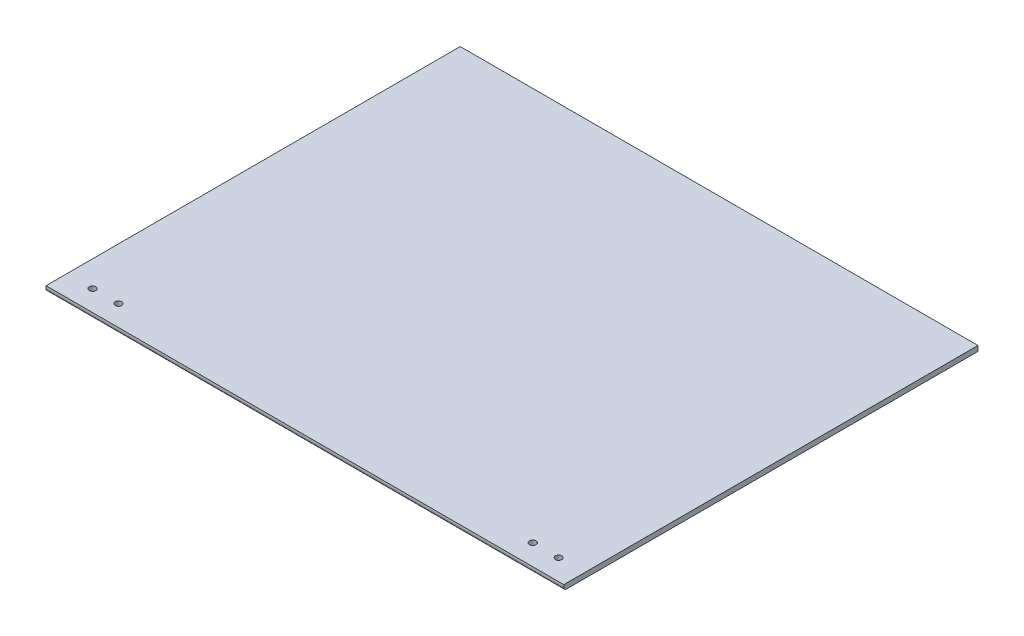
ISO-10303-21;
HEADER;
FILE_DESCRIPTION(('STEP AP214'),'2;1');
FILE_NAME('part.step','',(''),(''),'','','');
FILE_SCHEMA(('AUTOMOTIVE_DESIGN { 1 0 10303 214 1 1 1 1 }'));
ENDSEC;
DATA;
#1=APPLICATION_CONTEXT('core data for automotive mechanical design processes');
#2=APPLICATION_PROTOCOL_DEFINITION('international standard','automotive_design',2000,#1);
#3=PRODUCT_CONTEXT('',#1,'mechanical');
#4=PRODUCT('Part','Part','',(#3));
#5=PRODUCT_RELATED_PRODUCT_CATEGORY('part','',(#4));
#6=PRODUCT_DEFINITION_FORMATION('','',#4);
#7=PRODUCT_DEFINITION_CONTEXT('part definition',#1,'design');
#8=PRODUCT_DEFINITION('design','',#6,#7);
#9=PRODUCT_DEFINITION_SHAPE('','',#8);
#10=(LENGTH_UNIT() NAMED_UNIT(*) SI_UNIT(.MILLI.,.METRE.));
#11=(NAMED_UNIT(*) PLANE_ANGLE_UNIT() SI_UNIT($,.RADIAN.));
#12=(NAMED_UNIT(*) SI_UNIT($,.STERADIAN.) SOLID_ANGLE_UNIT());
#13=UNCERTAINTY_MEASURE_WITH_UNIT(LENGTH_MEASURE(1.E-05),#10,'distance_accuracy_value','');
#14=(GEOMETRIC_REPRESENTATION_CONTEXT(3) GLOBAL_UNCERTAINTY_ASSIGNED_CONTEXT((#13)) GLOBAL_UNIT_ASSIGNED_CONTEXT((#10,
#11,#12)) REPRESENTATION_CONTEXT('',''));
#15=CARTESIAN_POINT('',(0.,0.,0.));
#16=DIRECTION('',(0.,0.,1.));
#17=DIRECTION('',(1.,0.,0.));
#18=AXIS2_PLACEMENT_3D('',#15,#16,#17);
#19=CARTESIAN_POINT('',(0.,2.5,-2.5));
#20=DIRECTION('',(-1.,0.,0.));
#21=DIRECTION('',(0.,0.,1.));
#22=AXIS2_PLACEMENT_3D('',#19,#20,#21);
#23=CYLINDRICAL_SURFACE('',#22,2.5);
#24=DIRECTION('',(1.,0.,0.));
#25=VECTOR('',#24,1.);
#26=CARTESIAN_POINT('',(0.,2.5,0.));
#27=LINE('',#26,#25);
#28=CARTESIAN_POINT('',(0.,2.5,0.));
#29=VERTEX_POINT('',#28);
#30=CARTESIAN_POINT('',(500.,2.5,0.));
#31=VERTEX_POINT('',#30);
#32=EDGE_CURVE('E100',#29,#31,#27,.T.);
#33=ORIENTED_EDGE('',*,*,#32,.F.);
#34=CARTESIAN_POINT('',(0.,2.5,-2.5));
#35=DIRECTION('',(1.,0.,0.));
#36=DIRECTION('',(0.,0.,-1.));
#37=AXIS2_PLACEMENT_3D('',#34,#35,#36);
#38=CIRCLE('',#37,2.5);
#39=CARTESIAN_POINT('',(0.,0.,-2.5));
#40=VERTEX_POINT('',#39);
#41=EDGE_CURVE('E40',#40,#29,#38,.F.);
#42=ORIENTED_EDGE('',*,*,#41,.F.);
#43=DIRECTION('',(1.,0.,0.));
#44=VECTOR('',#43,1.);
#45=CARTESIAN_POINT('',(0.,0.,-2.5));
#46=LINE('',#45,#44);
#47=CARTESIAN_POINT('',(500.,0.,-2.5));
#48=VERTEX_POINT('',#47);
#49=EDGE_CURVE('E102',#48,#40,#46,.F.);
#50=ORIENTED_EDGE('',*,*,#49,.F.);
#51=CARTESIAN_POINT('',(500.,2.5,-2.5));
#52=DIRECTION('',(-1.,0.,0.));
#53=DIRECTION('',(0.,0.,1.));
#54=AXIS2_PLACEMENT_3D('',#51,#52,#53);
#55=CIRCLE('',#54,2.5);
#56=EDGE_CURVE('E11',#31,#48,#55,.F.);
#57=ORIENTED_EDGE('',*,*,#56,.F.);
#58=EDGE_LOOP('',(#33,#42,#50,#57));
#59=FACE_BOUND('',#58,.T.);
#60=ADVANCED_FACE('F33',(#59),#23,.T.);
#61=CARTESIAN_POINT('',(0.,5.,-400.));
#62=DIRECTION('',(0.,-1.,0.));
#63=DIRECTION('',(0.,0.,-1.));
#64=AXIS2_PLACEMENT_3D('',#61,#62,#63);
#65=PLANE('',#64);
#66=CARTESIAN_POINT('',(450.,5.,-20.));
#67=DIRECTION('',(0.,1.,0.));
#68=DIRECTION('',(0.,0.,1.));
#69=AXIS2_PLACEMENT_3D('',#66,#67,#68);
#70=CIRCLE('',#69,3.17499999999997);
#71=CARTESIAN_POINT('',(450.,5.,-16.8250000000001));
#72=VERTEX_POINT('',#71);
#73=EDGE_CURVE('E123',#72,#72,#70,.T.);
#74=ORIENTED_EDGE('',*,*,#73,.F.);
#75=EDGE_LOOP('',(#74));
#76=FACE_BOUND('',#75,.T.);
#77=CARTESIAN_POINT('',(475.,5.,-20.));
#78=DIRECTION('',(0.,1.,0.));
#79=DIRECTION('',(0.,0.,1.));
#80=AXIS2_PLACEMENT_3D('',#77,#78,#79);
#81=CIRCLE('',#80,3.17499999999997);
#82=CARTESIAN_POINT('',(475.,5.,-16.8250000000001));
#83=VERTEX_POINT('',#82);
#84=EDGE_CURVE('E120',#83,#83,#81,.T.);
#85=ORIENTED_EDGE('',*,*,#84,.F.);
#86=EDGE_LOOP('',(#85));
#87=FACE_BOUND('',#86,.T.);
#88=CARTESIAN_POINT('',(25.,5.,-20.));
#89=DIRECTION('',(0.,1.,0.));
#90=DIRECTION('',(0.,0.,1.));
#91=AXIS2_PLACEMENT_3D('',#88,#89,#90);
#92=CIRCLE('',#91,3.17499999999997);
#93=CARTESIAN_POINT('',(25.,5.,-16.825));
#94=VERTEX_POINT('',#93);
#95=EDGE_CURVE('E112',#94,#94,#92,.F.);
#96=ORIENTED_EDGE('',*,*,#95,.T.);
#97=EDGE_LOOP('',(#96));
#98=FACE_BOUND('',#97,.T.);
#99=DIRECTION('',(0.,0.,1.));
#100=VECTOR('',#99,1.);
#101=CARTESIAN_POINT('',(0.,5.,0.));
#102=LINE('',#101,#100);
#103=CARTESIAN_POINT('',(0.,5.,-400.));
#104=VERTEX_POINT('',#103);
#105=CARTESIAN_POINT('',(0.,5.,0.));
#106=VERTEX_POINT('',#105);
#107=EDGE_CURVE('E86',#104,#106,#102,.T.);
#108=ORIENTED_EDGE('',*,*,#107,.T.);
#109=DIRECTION('',(1.,0.,0.));
#110=VECTOR('',#109,1.);
#111=CARTESIAN_POINT('',(0.,5.,0.));
#112=LINE('',#111,#110);
#113=CARTESIAN_POINT('',(500.,5.,0.));
#114=VERTEX_POINT('',#113);
#115=EDGE_CURVE('E76',#106,#114,#112,.T.);
#116=ORIENTED_EDGE('',*,*,#115,.T.);
#117=DIRECTION('',(0.,0.,-1.));
#118=VECTOR('',#117,1.);
#119=CARTESIAN_POINT('',(500.,5.,0.));
#120=LINE('',#119,#118);
#121=CARTESIAN_POINT('',(500.,5.,-400.));
#122=VERTEX_POINT('',#121);
#123=EDGE_CURVE('E85',#114,#122,#120,.T.);
#124=ORIENTED_EDGE('',*,*,#123,.T.);
#125=DIRECTION('',(-1.,0.,0.));
#126=VECTOR('',#125,1.);
#127=CARTESIAN_POINT('',(0.,5.,-400.));
#128=LINE('',#127,#126);
#129=EDGE_CURVE('E92',#122,#104,#128,.T.);
#130=ORIENTED_EDGE('',*,*,#129,.T.);
#131=EDGE_LOOP('',(#108,#116,#124,#130));
#132=FACE_BOUND('',#131,.T.);
#133=CARTESIAN_POINT('',(50.,5.,-20.));
#134=DIRECTION('',(0.,1.,0.));
#135=DIRECTION('',(0.,0.,1.));
#136=AXIS2_PLACEMENT_3D('',#133,#134,#135);
#137=CIRCLE('',#136,3.17499999999997);
#138=CARTESIAN_POINT('',(50.,5.,-16.825));
#139=VERTEX_POINT('',#138);
#140=EDGE_CURVE('E116',#139,#139,#137,.F.);
#141=ORIENTED_EDGE('',*,*,#140,.T.);
#142=EDGE_LOOP('',(#141));
#143=FACE_BOUND('',#142,.T.);
#144=ADVANCED_FACE('F89',(#76,#87,#98,#132,#143),#65,.F.);
#145=CARTESIAN_POINT('',(0.,0.,-400.));
#146=DIRECTION('',(0.,-1.,0.));
#147=DIRECTION('',(0.,0.,-1.));
#148=AXIS2_PLACEMENT_3D('',#145,#146,#147);
#149=PLANE('',#148);
#150=CARTESIAN_POINT('',(450.,0.,-20.));
#151=DIRECTION('',(0.,-1.,0.));
#152=DIRECTION('',(0.,0.,-1.));
#153=AXIS2_PLACEMENT_3D('',#150,#151,#152);
#154=CIRCLE('',#153,3.17499999999997);
#155=CARTESIAN_POINT('',(450.,0.,-16.8250000000001));
#156=VERTEX_POINT('',#155);
#157=EDGE_CURVE('E121',#156,#156,#154,.T.);
#158=ORIENTED_EDGE('',*,*,#157,.F.);
#159=EDGE_LOOP('',(#158));
#160=FACE_BOUND('',#159,.T.);
#161=CARTESIAN_POINT('',(475.,0.,-20.));
#162=DIRECTION('',(0.,-1.,0.));
#163=DIRECTION('',(0.,0.,-1.));
#164=AXIS2_PLACEMENT_3D('',#161,#162,#163);
#165=CIRCLE('',#164,3.17499999999997);
#166=CARTESIAN_POINT('',(475.,0.,-16.8250000000001));
#167=VERTEX_POINT('',#166);
#168=EDGE_CURVE('E117',#167,#167,#165,.T.);
#169=ORIENTED_EDGE('',*,*,#168,.F.);
#170=EDGE_LOOP('',(#169));
#171=FACE_BOUND('',#170,.T.);
#172=CARTESIAN_POINT('',(25.,0.,-20.));
#173=DIRECTION('',(0.,-1.,0.));
#174=DIRECTION('',(0.,0.,-1.));
#175=AXIS2_PLACEMENT_3D('',#172,#173,#174);
#176=CIRCLE('',#175,3.17499999999997);
#177=CARTESIAN_POINT('',(25.,0.,-16.825));
#178=VERTEX_POINT('',#177);
#179=EDGE_CURVE('E108',#178,#178,#176,.F.);
#180=ORIENTED_EDGE('',*,*,#179,.T.);
#181=EDGE_LOOP('',(#180));
#182=FACE_BOUND('',#181,.T.);
#183=DIRECTION('',(0.,0.,-1.));
#184=VECTOR('',#183,1.);
#185=CARTESIAN_POINT('',(500.,0.,0.));
#186=LINE('',#185,#184);
#187=CARTESIAN_POINT('',(500.,0.,-400.));
#188=VERTEX_POINT('',#187);
#189=EDGE_CURVE('E131',#48,#188,#186,.T.);
#190=ORIENTED_EDGE('',*,*,#189,.F.);
#191=ORIENTED_EDGE('',*,*,#49,.T.);
#192=DIRECTION('',(0.,0.,1.));
#193=VECTOR('',#192,1.);
#194=CARTESIAN_POINT('',(0.,0.,0.));
#195=LINE('',#194,#193);
#196=CARTESIAN_POINT('',(0.,0.,-400.));
#197=VERTEX_POINT('',#196);
#198=EDGE_CURVE('E111',#197,#40,#195,.T.);
#199=ORIENTED_EDGE('',*,*,#198,.F.);
#200=DIRECTION('',(-1.,0.,0.));
#201=VECTOR('',#200,1.);
#202=CARTESIAN_POINT('',(0.,0.,-400.));
#203=LINE('',#202,#201);
#204=EDGE_CURVE('E96',#188,#197,#203,.T.);
#205=ORIENTED_EDGE('',*,*,#204,.F.);
#206=EDGE_LOOP('',(#190,#191,#199,#205));
#207=FACE_BOUND('',#206,.T.);
#208=CARTESIAN_POINT('',(50.,0.,-20.));
#209=DIRECTION('',(0.,-1.,0.));
#210=DIRECTION('',(0.,0.,-1.));
#211=AXIS2_PLACEMENT_3D('',#208,#209,#210);
#212=CIRCLE('',#211,3.17499999999997);
#213=CARTESIAN_POINT('',(50.,0.,-16.825));
#214=VERTEX_POINT('',#213);
#215=EDGE_CURVE('E113',#214,#214,#212,.F.);
#216=ORIENTED_EDGE('',*,*,#215,.T.);
#217=EDGE_LOOP('',(#216));
#218=FACE_BOUND('',#217,.T.);
#219=ADVANCED_FACE('F128',(#160,#171,#182,#207,#218),#149,.T.);
#220=CARTESIAN_POINT('',(0.,5.,0.));
#221=DIRECTION('',(1.,0.,0.));
#222=DIRECTION('',(0.,0.,-1.));
#223=AXIS2_PLACEMENT_3D('',#220,#221,#222);
#224=PLANE('',#223);
#225=ORIENTED_EDGE('',*,*,#198,.T.);
#226=ORIENTED_EDGE('',*,*,#41,.T.);
#227=DIRECTION('',(0.,-1.,0.));
#228=VECTOR('',#227,1.);
#229=CARTESIAN_POINT('',(0.,5.,0.));
#230=LINE('',#229,#228);
#231=EDGE_CURVE('E81',#106,#29,#230,.T.);
#232=ORIENTED_EDGE('',*,*,#231,.F.);
#233=ORIENTED_EDGE('',*,*,#107,.F.);
#234=DIRECTION('',(0.,-1.,0.));
#235=VECTOR('',#234,1.);
#236=CARTESIAN_POINT('',(0.,5.,-400.));
#237=LINE('',#236,#235);
#238=EDGE_CURVE('E132',#104,#197,#237,.T.);
#239=ORIENTED_EDGE('',*,*,#238,.T.);
#240=EDGE_LOOP('',(#225,#226,#232,#233,#239));
#241=FACE_BOUND('',#240,.T.);
#242=ADVANCED_FACE('F99',(#241),#224,.F.);
#243=CARTESIAN_POINT('',(0.,5.,0.));
#244=DIRECTION('',(0.,0.,-1.));
#245=DIRECTION('',(-1.,0.,0.));
#246=AXIS2_PLACEMENT_3D('',#243,#244,#245);
#247=PLANE('',#246);
#248=ORIENTED_EDGE('',*,*,#231,.T.);
#249=ORIENTED_EDGE('',*,*,#32,.T.);
#250=DIRECTION('',(0.,-1.,0.));
#251=VECTOR('',#250,1.);
#252=CARTESIAN_POINT('',(500.,5.,0.));
#253=LINE('',#252,#251);
#254=EDGE_CURVE('E82',#114,#31,#253,.T.);
#255=ORIENTED_EDGE('',*,*,#254,.F.);
#256=ORIENTED_EDGE('',*,*,#115,.F.);
#257=EDGE_LOOP('',(#248,#249,#255,#256));
#258=FACE_BOUND('',#257,.T.);
#259=ADVANCED_FACE('F78',(#258),#247,.F.);
#260=CARTESIAN_POINT('',(500.,5.,0.));
#261=DIRECTION('',(-1.,0.,0.));
#262=DIRECTION('',(0.,0.,1.));
#263=AXIS2_PLACEMENT_3D('',#260,#261,#262);
#264=PLANE('',#263);
#265=ORIENTED_EDGE('',*,*,#254,.T.);
#266=ORIENTED_EDGE('',*,*,#56,.T.);
#267=ORIENTED_EDGE('',*,*,#189,.T.);
#268=DIRECTION('',(0.,-1.,0.));
#269=VECTOR('',#268,1.);
#270=CARTESIAN_POINT('',(500.,5.,-400.));
#271=LINE('',#270,#269);
#272=EDGE_CURVE('E104',#122,#188,#271,.T.);
#273=ORIENTED_EDGE('',*,*,#272,.F.);
#274=ORIENTED_EDGE('',*,*,#123,.F.);
#275=EDGE_LOOP('',(#265,#266,#267,#273,#274));
#276=FACE_BOUND('',#275,.T.);
#277=ADVANCED_FACE('F143',(#276),#264,.F.);
#278=CARTESIAN_POINT('',(0.,5.,-400.));
#279=DIRECTION('',(0.,0.,1.));
#280=DIRECTION('',(1.,0.,0.));
#281=AXIS2_PLACEMENT_3D('',#278,#279,#280);
#282=PLANE('',#281);
#283=ORIENTED_EDGE('',*,*,#204,.T.);
#284=ORIENTED_EDGE('',*,*,#238,.F.);
#285=ORIENTED_EDGE('',*,*,#129,.F.);
#286=ORIENTED_EDGE('',*,*,#272,.T.);
#287=EDGE_LOOP('',(#283,#284,#285,#286));
#288=FACE_BOUND('',#287,.T.);
#289=ADVANCED_FACE('F142',(#288),#282,.F.);
#290=CARTESIAN_POINT('',(25.,-4.99999999999999,-20.));
#291=DIRECTION('',(0.,1.,0.));
#292=DIRECTION('',(0.,0.,1.));
#293=AXIS2_PLACEMENT_3D('',#290,#291,#292);
#294=CYLINDRICAL_SURFACE('',#293,3.17499999999997);
#295=CARTESIAN_POINT('',(25.,0.,-16.825));
#296=CARTESIAN_POINT('',(25.,0.0520833333333334,-16.825));
#297=CARTESIAN_POINT('',(25.,0.104166666666667,-16.825));
#298=CARTESIAN_POINT('',(25.,0.208333333333334,-16.825));
#299=CARTESIAN_POINT('',(25.,0.260416666666667,-16.825));
#300=CARTESIAN_POINT('',(25.,0.364583333333333,-16.825));
#301=CARTESIAN_POINT('',(25.,0.416666666666666,-16.825));
#302=CARTESIAN_POINT('',(25.,0.520833333333333,-16.825));
#303=CARTESIAN_POINT('',(25.,0.572916666666666,-16.825));
#304=CARTESIAN_POINT('',(25.,0.677083333333333,-16.825));
#305=CARTESIAN_POINT('',(25.,0.729166666666667,-16.825));
#306=CARTESIAN_POINT('',(25.,0.833333333333333,-16.825));
#307=CARTESIAN_POINT('',(25.,0.885416666666667,-16.825));
#308=CARTESIAN_POINT('',(25.,0.989583333333333,-16.825));
#309=CARTESIAN_POINT('',(25.,1.04166666666667,-16.825));
#310=CARTESIAN_POINT('',(25.,1.14583333333333,-16.825));
#311=CARTESIAN_POINT('',(25.,1.19791666666667,-16.825));
#312=CARTESIAN_POINT('',(25.,1.30208333333333,-16.825));
#313=CARTESIAN_POINT('',(25.,1.35416666666667,-16.825));
#314=CARTESIAN_POINT('',(25.,1.45833333333333,-16.825));
#315=CARTESIAN_POINT('',(25.,1.51041666666667,-16.825));
#316=CARTESIAN_POINT('',(25.,1.61458333333333,-16.825));
#317=CARTESIAN_POINT('',(25.,1.66666666666667,-16.825));
#318=CARTESIAN_POINT('',(25.,1.77083333333333,-16.825));
#319=CARTESIAN_POINT('',(25.,1.82291666666667,-16.825));
#320=CARTESIAN_POINT('',(25.,1.92708333333333,-16.825));
#321=CARTESIAN_POINT('',(25.,1.97916666666667,-16.825));
#322=CARTESIAN_POINT('',(25.,2.08333333333333,-16.825));
#323=CARTESIAN_POINT('',(25.,2.13541666666667,-16.825));
#324=CARTESIAN_POINT('',(25.,2.23958333333333,-16.825));
#325=CARTESIAN_POINT('',(25.,2.29166666666667,-16.825));
#326=CARTESIAN_POINT('',(25.,2.39583333333333,-16.825));
#327=CARTESIAN_POINT('',(25.,2.44791666666667,-16.825));
#328=CARTESIAN_POINT('',(25.,2.55208333333333,-16.825));
#329=CARTESIAN_POINT('',(25.,2.60416666666667,-16.825));
#330=CARTESIAN_POINT('',(25.,2.70833333333333,-16.825));
#331=CARTESIAN_POINT('',(25.,2.76041666666667,-16.825));
#332=CARTESIAN_POINT('',(25.,2.86458333333333,-16.825));
#333=CARTESIAN_POINT('',(25.,2.91666666666667,-16.825));
#334=CARTESIAN_POINT('',(25.,3.02083333333333,-16.825));
#335=CARTESIAN_POINT('',(25.,3.07291666666667,-16.825));
#336=CARTESIAN_POINT('',(25.,3.17708333333333,-16.825));
#337=CARTESIAN_POINT('',(25.,3.22916666666667,-16.825));
#338=CARTESIAN_POINT('',(25.,3.33333333333333,-16.825));
#339=CARTESIAN_POINT('',(25.,3.38541666666667,-16.825));
#340=CARTESIAN_POINT('',(25.,3.48958333333333,-16.825));
#341=CARTESIAN_POINT('',(25.,3.54166666666667,-16.825));
#342=CARTESIAN_POINT('',(25.,3.64583333333333,-16.825));
#343=CARTESIAN_POINT('',(25.,3.69791666666667,-16.825));
#344=CARTESIAN_POINT('',(25.,3.80208333333333,-16.825));
#345=CARTESIAN_POINT('',(25.,3.85416666666667,-16.825));
#346=CARTESIAN_POINT('',(25.,3.95833333333333,-16.825));
#347=CARTESIAN_POINT('',(25.,4.01041666666666,-16.825));
#348=CARTESIAN_POINT('',(25.,4.11458333333333,-16.825));
#349=CARTESIAN_POINT('',(25.,4.16666666666666,-16.825));
#350=CARTESIAN_POINT('',(25.,4.27083333333333,-16.825));
#351=CARTESIAN_POINT('',(25.,4.32291666666666,-16.825));
#352=CARTESIAN_POINT('',(25.,4.42708333333333,-16.825));
#353=CARTESIAN_POINT('',(25.,4.47916666666666,-16.825));
#354=CARTESIAN_POINT('',(25.,4.58333333333333,-16.825));
#355=CARTESIAN_POINT('',(25.,4.63541666666666,-16.825));
#356=CARTESIAN_POINT('',(25.,4.73958333333333,-16.825));
#357=CARTESIAN_POINT('',(25.,4.79166666666666,-16.825));
#358=CARTESIAN_POINT('',(25.,4.89583333333333,-16.825));
#359=CARTESIAN_POINT('',(25.,4.94791666666666,-16.825));
#360=CARTESIAN_POINT('',(25.,5.,-16.825));
#361=B_SPLINE_CURVE_WITH_KNOTS('',3,(#295,#296,#297,#298,#299,#300,#301,#302,#303,#304,#305,
#306,#307,#308,#309,#310,#311,#312,#313,#314,#315,#316,#317,#318,#319,#320,#321,#322,#323,#324,
#325,#326,#327,#328,#329,#330,#331,#332,#333,#334,#335,#336,#337,#338,#339,#340,#341,#342,#343,
#344,#345,#346,#347,#348,#349,#350,#351,#352,#353,#354,#355,#356,#357,#358,#359,#360),
.UNSPECIFIED.,.F.,.F.,(4,2,2,2,2,2,2,2,2,2,2,2,2,2,2,2,2,2,2,2,2,2,2,2,2,2,2,2,2,2,2,2,4),(0.,
0.15625,0.3125,0.46875,0.625,0.78125,0.9375,1.09375,1.25,1.40625,1.5625,1.71875,1.875,2.03125,
2.1875,2.34375,2.5,2.65625,2.8125,2.96875,3.125,3.28125,3.4375,3.59375,3.75,3.90625,4.0625,
4.21875,4.375,4.53125,4.6875,4.84375,5.),.UNSPECIFIED.);
#362=EDGE_CURVE('BSEAM163',#178,#94,#361,.T.);
#363=ORIENTED_EDGE('',*,*,#179,.F.);
#364=ORIENTED_EDGE('',*,*,#95,.F.);
#365=ORIENTED_EDGE('',*,*,#362,.T.);
#366=ORIENTED_EDGE('',*,*,#362,.F.);
#367=EDGE_LOOP('',(#363,#365,#364,#366));
#368=FACE_BOUND('',#367,.T.);
#369=ADVANCED_FACE('F163',(#368),#294,.F.);
#370=CARTESIAN_POINT('',(50.,-4.99999999999999,-20.));
#371=DIRECTION('',(0.,1.,0.));
#372=DIRECTION('',(0.,0.,1.));
#373=AXIS2_PLACEMENT_3D('',#370,#371,#372);
#374=CYLINDRICAL_SURFACE('',#373,3.17499999999997);
#375=CARTESIAN_POINT('',(50.,0.,-16.825));
#376=CARTESIAN_POINT('',(50.,0.0520833333333334,-16.825));
#377=CARTESIAN_POINT('',(50.,0.104166666666667,-16.825));
#378=CARTESIAN_POINT('',(50.,0.208333333333334,-16.825));
#379=CARTESIAN_POINT('',(50.,0.260416666666667,-16.825));
#380=CARTESIAN_POINT('',(50.,0.364583333333333,-16.825));
#381=CARTESIAN_POINT('',(50.,0.416666666666666,-16.825));
#382=CARTESIAN_POINT('',(50.,0.520833333333333,-16.825));
#383=CARTESIAN_POINT('',(50.,0.572916666666666,-16.825));
#384=CARTESIAN_POINT('',(50.,0.677083333333333,-16.825));
#385=CARTESIAN_POINT('',(50.,0.729166666666667,-16.825));
#386=CARTESIAN_POINT('',(50.,0.833333333333333,-16.825));
#387=CARTESIAN_POINT('',(50.,0.885416666666667,-16.825));
#388=CARTESIAN_POINT('',(50.,0.989583333333333,-16.825));
#389=CARTESIAN_POINT('',(50.,1.04166666666667,-16.825));
#390=CARTESIAN_POINT('',(50.,1.14583333333333,-16.825));
#391=CARTESIAN_POINT('',(50.,1.19791666666667,-16.825));
#392=CARTESIAN_POINT('',(50.,1.30208333333333,-16.825));
#393=CARTESIAN_POINT('',(50.,1.35416666666667,-16.825));
#394=CARTESIAN_POINT('',(50.,1.45833333333333,-16.825));
#395=CARTESIAN_POINT('',(50.,1.51041666666667,-16.825));
#396=CARTESIAN_POINT('',(50.,1.61458333333333,-16.825));
#397=CARTESIAN_POINT('',(50.,1.66666666666667,-16.825));
#398=CARTESIAN_POINT('',(50.,1.77083333333333,-16.825));
#399=CARTESIAN_POINT('',(50.,1.82291666666667,-16.825));
#400=CARTESIAN_POINT('',(50.,1.92708333333333,-16.825));
#401=CARTESIAN_POINT('',(50.,1.97916666666667,-16.825));
#402=CARTESIAN_POINT('',(50.,2.08333333333333,-16.825));
#403=CARTESIAN_POINT('',(50.,2.13541666666667,-16.825));
#404=CARTESIAN_POINT('',(50.,2.23958333333333,-16.825));
#405=CARTESIAN_POINT('',(50.,2.29166666666667,-16.825));
#406=CARTESIAN_POINT('',(50.,2.39583333333333,-16.825));
#407=CARTESIAN_POINT('',(50.,2.44791666666667,-16.825));
#408=CARTESIAN_POINT('',(50.,2.55208333333333,-16.825));
#409=CARTESIAN_POINT('',(50.,2.60416666666667,-16.825));
#410=CARTESIAN_POINT('',(50.,2.70833333333333,-16.825));
#411=CARTESIAN_POINT('',(50.,2.76041666666667,-16.825));
#412=CARTESIAN_POINT('',(50.,2.86458333333333,-16.825));
#413=CARTESIAN_POINT('',(50.,2.91666666666667,-16.825));
#414=CARTESIAN_POINT('',(50.,3.02083333333333,-16.825));
#415=CARTESIAN_POINT('',(50.,3.07291666666667,-16.825));
#416=CARTESIAN_POINT('',(50.,3.17708333333333,-16.825));
#417=CARTESIAN_POINT('',(50.,3.22916666666667,-16.825));
#418=CARTESIAN_POINT('',(50.,3.33333333333333,-16.825));
#419=CARTESIAN_POINT('',(50.,3.38541666666667,-16.825));
#420=CARTESIAN_POINT('',(50.,3.48958333333333,-16.825));
#421=CARTESIAN_POINT('',(50.,3.54166666666667,-16.825));
#422=CARTESIAN_POINT('',(50.,3.64583333333333,-16.825));
#423=CARTESIAN_POINT('',(50.,3.69791666666667,-16.825));
#424=CARTESIAN_POINT('',(50.,3.80208333333333,-16.825));
#425=CARTESIAN_POINT('',(50.,3.85416666666667,-16.825));
#426=CARTESIAN_POINT('',(50.,3.95833333333333,-16.825));
#427=CARTESIAN_POINT('',(50.,4.01041666666666,-16.825));
#428=CARTESIAN_POINT('',(50.,4.11458333333333,-16.825));
#429=CARTESIAN_POINT('',(50.,4.16666666666666,-16.825));
#430=CARTESIAN_POINT('',(50.,4.27083333333333,-16.825));
#431=CARTESIAN_POINT('',(50.,4.32291666666666,-16.825));
#432=CARTESIAN_POINT('',(50.,4.42708333333333,-16.825));
#433=CARTESIAN_POINT('',(50.,4.47916666666666,-16.825));
#434=CARTESIAN_POINT('',(50.,4.58333333333333,-16.825));
#435=CARTESIAN_POINT('',(50.,4.63541666666666,-16.825));
#436=CARTESIAN_POINT('',(50.,4.73958333333333,-16.825));
#437=CARTESIAN_POINT('',(50.,4.79166666666666,-16.825));
#438=CARTESIAN_POINT('',(50.,4.89583333333333,-16.825));
#439=CARTESIAN_POINT('',(50.,4.94791666666666,-16.825));
#440=CARTESIAN_POINT('',(50.,5.,-16.825));
#441=B_SPLINE_CURVE_WITH_KNOTS('',3,(#375,#376,#377,#378,#379,#380,#381,#382,#383,#384,#385,
#386,#387,#388,#389,#390,#391,#392,#393,#394,#395,#396,#397,#398,#399,#400,#401,#402,#403,#404,
#405,#406,#407,#408,#409,#410,#411,#412,#413,#414,#415,#416,#417,#418,#419,#420,#421,#422,#423,
#424,#425,#426,#427,#428,#429,#430,#431,#432,#433,#434,#435,#436,#437,#438,#439,#440),
.UNSPECIFIED.,.F.,.F.,(4,2,2,2,2,2,2,2,2,2,2,2,2,2,2,2,2,2,2,2,2,2,2,2,2,2,2,2,2,2,2,2,4),(0.,
0.15625,0.3125,0.46875,0.625,0.78125,0.9375,1.09375,1.25,1.40625,1.5625,1.71875,1.875,2.03125,
2.1875,2.34375,2.5,2.65625,2.8125,2.96875,3.125,3.28125,3.4375,3.59375,3.75,3.90625,4.0625,
4.21875,4.375,4.53125,4.6875,4.84375,5.),.UNSPECIFIED.);
#442=EDGE_CURVE('BSEAM165',#214,#139,#441,.T.);
#443=ORIENTED_EDGE('',*,*,#215,.F.);
#444=ORIENTED_EDGE('',*,*,#140,.F.);
#445=ORIENTED_EDGE('',*,*,#442,.T.);
#446=ORIENTED_EDGE('',*,*,#442,.F.);
#447=EDGE_LOOP('',(#443,#445,#444,#446));
#448=FACE_BOUND('',#447,.T.);
#449=ADVANCED_FACE('F165',(#448),#374,.F.);
#450=CARTESIAN_POINT('',(475.,-4.99999999999999,-20.));
#451=DIRECTION('',(0.,1.,0.));
#452=DIRECTION('',(0.,0.,1.));
#453=AXIS2_PLACEMENT_3D('',#450,#451,#452);
#454=CYLINDRICAL_SURFACE('',#453,3.17499999999997);
#455=CARTESIAN_POINT('',(475.,0.,-16.8250000000001));
#456=CARTESIAN_POINT('',(475.,0.0520833333333334,-16.8250000000001));
#457=CARTESIAN_POINT('',(475.,0.104166666666667,-16.8250000000001));
#458=CARTESIAN_POINT('',(475.,0.208333333333334,-16.8250000000001));
#459=CARTESIAN_POINT('',(475.,0.260416666666667,-16.8250000000001));
#460=CARTESIAN_POINT('',(475.,0.364583333333333,-16.8250000000001));
#461=CARTESIAN_POINT('',(475.,0.416666666666666,-16.8250000000001));
#462=CARTESIAN_POINT('',(475.,0.520833333333333,-16.8250000000001));
#463=CARTESIAN_POINT('',(475.,0.572916666666666,-16.8250000000001));
#464=CARTESIAN_POINT('',(475.,0.677083333333333,-16.8250000000001));
#465=CARTESIAN_POINT('',(475.,0.729166666666667,-16.8250000000001));
#466=CARTESIAN_POINT('',(475.,0.833333333333333,-16.8250000000001));
#467=CARTESIAN_POINT('',(475.,0.885416666666667,-16.8250000000001));
#468=CARTESIAN_POINT('',(475.,0.989583333333333,-16.8250000000001));
#469=CARTESIAN_POINT('',(475.,1.04166666666667,-16.8250000000001));
#470=CARTESIAN_POINT('',(475.,1.14583333333333,-16.8250000000001));
#471=CARTESIAN_POINT('',(475.,1.19791666666667,-16.8250000000001));
#472=CARTESIAN_POINT('',(475.,1.30208333333333,-16.8250000000001));
#473=CARTESIAN_POINT('',(475.,1.35416666666667,-16.8250000000001));
#474=CARTESIAN_POINT('',(475.,1.45833333333333,-16.8250000000001));
#475=CARTESIAN_POINT('',(475.,1.51041666666667,-16.8250000000001));
#476=CARTESIAN_POINT('',(475.,1.61458333333333,-16.8250000000001));
#477=CARTESIAN_POINT('',(475.,1.66666666666667,-16.8250000000001));
#478=CARTESIAN_POINT('',(475.,1.77083333333333,-16.8250000000001));
#479=CARTESIAN_POINT('',(475.,1.82291666666667,-16.8250000000001));
#480=CARTESIAN_POINT('',(475.,1.92708333333333,-16.8250000000001));
#481=CARTESIAN_POINT('',(475.,1.97916666666667,-16.8250000000001));
#482=CARTESIAN_POINT('',(475.,2.08333333333333,-16.8250000000001));
#483=CARTESIAN_POINT('',(475.,2.13541666666667,-16.8250000000001));
#484=CARTESIAN_POINT('',(475.,2.23958333333333,-16.8250000000001));
#485=CARTESIAN_POINT('',(475.,2.29166666666667,-16.8250000000001));
#486=CARTESIAN_POINT('',(475.,2.39583333333333,-16.8250000000001));
#487=CARTESIAN_POINT('',(475.,2.44791666666667,-16.8250000000001));
#488=CARTESIAN_POINT('',(475.,2.55208333333333,-16.8250000000001));
#489=CARTESIAN_POINT('',(475.,2.60416666666667,-16.8250000000001));
#490=CARTESIAN_POINT('',(475.,2.70833333333333,-16.8250000000001));
#491=CARTESIAN_POINT('',(475.,2.76041666666667,-16.8250000000001));
#492=CARTESIAN_POINT('',(475.,2.86458333333333,-16.8250000000001));
#493=CARTESIAN_POINT('',(475.,2.91666666666667,-16.8250000000001));
#494=CARTESIAN_POINT('',(475.,3.02083333333333,-16.8250000000001));
#495=CARTESIAN_POINT('',(475.,3.07291666666667,-16.8250000000001));
#496=CARTESIAN_POINT('',(475.,3.17708333333333,-16.8250000000001));
#497=CARTESIAN_POINT('',(475.,3.22916666666667,-16.8250000000001));
#498=CARTESIAN_POINT('',(475.,3.33333333333333,-16.8250000000001));
#499=CARTESIAN_POINT('',(475.,3.38541666666667,-16.8250000000001));
#500=CARTESIAN_POINT('',(475.,3.48958333333333,-16.8250000000001));
#501=CARTESIAN_POINT('',(475.,3.54166666666667,-16.8250000000001));
#502=CARTESIAN_POINT('',(475.,3.64583333333333,-16.8250000000001));
#503=CARTESIAN_POINT('',(475.,3.69791666666667,-16.8250000000001));
#504=CARTESIAN_POINT('',(475.,3.80208333333333,-16.8250000000001));
#505=CARTESIAN_POINT('',(475.,3.85416666666667,-16.8250000000001));
#506=CARTESIAN_POINT('',(475.,3.95833333333333,-16.8250000000001));
#507=CARTESIAN_POINT('',(475.,4.01041666666666,-16.8250000000001));
#508=CARTESIAN_POINT('',(475.,4.11458333333333,-16.8250000000001));
#509=CARTESIAN_POINT('',(475.,4.16666666666666,-16.8250000000001));
#510=CARTESIAN_POINT('',(475.,4.27083333333333,-16.8250000000001));
#511=CARTESIAN_POINT('',(475.,4.32291666666666,-16.8250000000001));
#512=CARTESIAN_POINT('',(475.,4.42708333333333,-16.8250000000001));
#513=CARTESIAN_POINT('',(475.,4.47916666666666,-16.8250000000001));
#514=CARTESIAN_POINT('',(475.,4.58333333333333,-16.8250000000001));
#515=CARTESIAN_POINT('',(475.,4.63541666666666,-16.8250000000001));
#516=CARTESIAN_POINT('',(475.,4.73958333333333,-16.8250000000001));
#517=CARTESIAN_POINT('',(475.,4.79166666666666,-16.8250000000001));
#518=CARTESIAN_POINT('',(475.,4.89583333333333,-16.8250000000001));
#519=CARTESIAN_POINT('',(475.,4.94791666666666,-16.8250000000001));
#520=CARTESIAN_POINT('',(475.,5.,-16.8250000000001));
#521=B_SPLINE_CURVE_WITH_KNOTS('',3,(#455,#456,#457,#458,#459,#460,#461,#462,#463,#464,#465,
#466,#467,#468,#469,#470,#471,#472,#473,#474,#475,#476,#477,#478,#479,#480,#481,#482,#483,#484,
#485,#486,#487,#488,#489,#490,#491,#492,#493,#494,#495,#496,#497,#498,#499,#500,#501,#502,#503,
#504,#505,#506,#507,#508,#509,#510,#511,#512,#513,#514,#515,#516,#517,#518,#519,#520),
.UNSPECIFIED.,.F.,.F.,(4,2,2,2,2,2,2,2,2,2,2,2,2,2,2,2,2,2,2,2,2,2,2,2,2,2,2,2,2,2,2,2,4),(0.,
0.15625,0.3125,0.46875,0.625,0.78125,0.9375,1.09375,1.25,1.40625,1.5625,1.71875,1.875,2.03125,
2.1875,2.34375,2.5,2.65625,2.8125,2.96875,3.125,3.28125,3.4375,3.59375,3.75,3.90625,4.0625,
4.21875,4.375,4.53125,4.6875,4.84375,5.),.UNSPECIFIED.);
#522=EDGE_CURVE('BSEAM172',#167,#83,#521,.T.);
#523=ORIENTED_EDGE('',*,*,#168,.T.);
#524=ORIENTED_EDGE('',*,*,#84,.T.);
#525=ORIENTED_EDGE('',*,*,#522,.T.);
#526=ORIENTED_EDGE('',*,*,#522,.F.);
#527=EDGE_LOOP('',(#523,#525,#524,#526));
#528=FACE_BOUND('',#527,.T.);
#529=ADVANCED_FACE('F172',(#528),#454,.F.);
#530=CARTESIAN_POINT('',(450.,-4.99999999999999,-20.));
#531=DIRECTION('',(0.,1.,0.));
#532=DIRECTION('',(0.,0.,1.));
#533=AXIS2_PLACEMENT_3D('',#530,#531,#532);
#534=CYLINDRICAL_SURFACE('',#533,3.17499999999997);
#535=CARTESIAN_POINT('',(450.,0.,-16.8250000000001));
#536=CARTESIAN_POINT('',(450.,0.0520833333333334,-16.8250000000001));
#537=CARTESIAN_POINT('',(450.,0.104166666666667,-16.8250000000001));
#538=CARTESIAN_POINT('',(450.,0.208333333333334,-16.8250000000001));
#539=CARTESIAN_POINT('',(450.,0.260416666666667,-16.8250000000001));
#540=CARTESIAN_POINT('',(450.,0.364583333333333,-16.8250000000001));
#541=CARTESIAN_POINT('',(450.,0.416666666666666,-16.8250000000001));
#542=CARTESIAN_POINT('',(450.,0.520833333333333,-16.8250000000001));
#543=CARTESIAN_POINT('',(450.,0.572916666666666,-16.8250000000001));
#544=CARTESIAN_POINT('',(450.,0.677083333333333,-16.8250000000001));
#545=CARTESIAN_POINT('',(450.,0.729166666666667,-16.8250000000001));
#546=CARTESIAN_POINT('',(450.,0.833333333333333,-16.8250000000001));
#547=CARTESIAN_POINT('',(450.,0.885416666666667,-16.8250000000001));
#548=CARTESIAN_POINT('',(450.,0.989583333333333,-16.8250000000001));
#549=CARTESIAN_POINT('',(450.,1.04166666666667,-16.8250000000001));
#550=CARTESIAN_POINT('',(450.,1.14583333333333,-16.8250000000001));
#551=CARTESIAN_POINT('',(450.,1.19791666666667,-16.8250000000001));
#552=CARTESIAN_POINT('',(450.,1.30208333333333,-16.8250000000001));
#553=CARTESIAN_POINT('',(450.,1.35416666666667,-16.8250000000001));
#554=CARTESIAN_POINT('',(450.,1.45833333333333,-16.8250000000001));
#555=CARTESIAN_POINT('',(450.,1.51041666666667,-16.8250000000001));
#556=CARTESIAN_POINT('',(450.,1.61458333333333,-16.8250000000001));
#557=CARTESIAN_POINT('',(450.,1.66666666666667,-16.8250000000001));
#558=CARTESIAN_POINT('',(450.,1.77083333333333,-16.8250000000001));
#559=CARTESIAN_POINT('',(450.,1.82291666666667,-16.8250000000001));
#560=CARTESIAN_POINT('',(450.,1.92708333333333,-16.8250000000001));
#561=CARTESIAN_POINT('',(450.,1.97916666666667,-16.8250000000001));
#562=CARTESIAN_POINT('',(450.,2.08333333333333,-16.8250000000001));
#563=CARTESIAN_POINT('',(450.,2.13541666666667,-16.8250000000001));
#564=CARTESIAN_POINT('',(450.,2.23958333333333,-16.8250000000001));
#565=CARTESIAN_POINT('',(450.,2.29166666666667,-16.8250000000001));
#566=CARTESIAN_POINT('',(450.,2.39583333333333,-16.8250000000001));
#567=CARTESIAN_POINT('',(450.,2.44791666666667,-16.8250000000001));
#568=CARTESIAN_POINT('',(450.,2.55208333333333,-16.8250000000001));
#569=CARTESIAN_POINT('',(450.,2.60416666666667,-16.8250000000001));
#570=CARTESIAN_POINT('',(450.,2.70833333333333,-16.8250000000001));
#571=CARTESIAN_POINT('',(450.,2.76041666666667,-16.8250000000001));
#572=CARTESIAN_POINT('',(450.,2.86458333333333,-16.8250000000001));
#573=CARTESIAN_POINT('',(450.,2.91666666666667,-16.8250000000001));
#574=CARTESIAN_POINT('',(450.,3.02083333333333,-16.8250000000001));
#575=CARTESIAN_POINT('',(450.,3.07291666666667,-16.8250000000001));
#576=CARTESIAN_POINT('',(450.,3.17708333333333,-16.8250000000001));
#577=CARTESIAN_POINT('',(450.,3.22916666666667,-16.8250000000001));
#578=CARTESIAN_POINT('',(450.,3.33333333333333,-16.8250000000001));
#579=CARTESIAN_POINT('',(450.,3.38541666666667,-16.8250000000001));
#580=CARTESIAN_POINT('',(450.,3.48958333333333,-16.8250000000001));
#581=CARTESIAN_POINT('',(450.,3.54166666666667,-16.8250000000001));
#582=CARTESIAN_POINT('',(450.,3.64583333333333,-16.8250000000001));
#583=CARTESIAN_POINT('',(450.,3.69791666666667,-16.8250000000001));
#584=CARTESIAN_POINT('',(450.,3.80208333333333,-16.8250000000001));
#585=CARTESIAN_POINT('',(450.,3.85416666666667,-16.8250000000001));
#586=CARTESIAN_POINT('',(450.,3.95833333333333,-16.8250000000001));
#587=CARTESIAN_POINT('',(450.,4.01041666666666,-16.8250000000001));
#588=CARTESIAN_POINT('',(450.,4.11458333333333,-16.8250000000001));
#589=CARTESIAN_POINT('',(450.,4.16666666666666,-16.8250000000001));
#590=CARTESIAN_POINT('',(450.,4.27083333333333,-16.8250000000001));
#591=CARTESIAN_POINT('',(450.,4.32291666666666,-16.8250000000001));
#592=CARTESIAN_POINT('',(450.,4.42708333333333,-16.8250000000001));
#593=CARTESIAN_POINT('',(450.,4.47916666666666,-16.8250000000001));
#594=CARTESIAN_POINT('',(450.,4.58333333333333,-16.8250000000001));
#595=CARTESIAN_POINT('',(450.,4.63541666666666,-16.8250000000001));
#596=CARTESIAN_POINT('',(450.,4.73958333333333,-16.8250000000001));
#597=CARTESIAN_POINT('',(450.,4.79166666666666,-16.8250000000001));
#598=CARTESIAN_POINT('',(450.,4.89583333333333,-16.8250000000001));
#599=CARTESIAN_POINT('',(450.,4.94791666666666,-16.8250000000001));
#600=CARTESIAN_POINT('',(450.,5.,-16.8250000000001));
#601=B_SPLINE_CURVE_WITH_KNOTS('',3,(#535,#536,#537,#538,#539,#540,#541,#542,#543,#544,#545,
#546,#547,#548,#549,#550,#551,#552,#553,#554,#555,#556,#557,#558,#559,#560,#561,#562,#563,#564,
#565,#566,#567,#568,#569,#570,#571,#572,#573,#574,#575,#576,#577,#578,#579,#580,#581,#582,#583,
#584,#585,#586,#587,#588,#589,#590,#591,#592,#593,#594,#595,#596,#597,#598,#599,#600),
.UNSPECIFIED.,.F.,.F.,(4,2,2,2,2,2,2,2,2,2,2,2,2,2,2,2,2,2,2,2,2,2,2,2,2,2,2,2,2,2,2,2,4),(0.,
0.15625,0.3125,0.46875,0.625,0.78125,0.9375,1.09375,1.25,1.40625,1.5625,1.71875,1.875,2.03125,
2.1875,2.34375,2.5,2.65625,2.8125,2.96875,3.125,3.28125,3.4375,3.59375,3.75,3.90625,4.0625,
4.21875,4.375,4.53125,4.6875,4.84375,5.),.UNSPECIFIED.);
#602=EDGE_CURVE('BSEAM154',#156,#72,#601,.T.);
#603=ORIENTED_EDGE('',*,*,#157,.T.);
#604=ORIENTED_EDGE('',*,*,#73,.T.);
#605=ORIENTED_EDGE('',*,*,#602,.T.);
#606=ORIENTED_EDGE('',*,*,#602,.F.);
#607=EDGE_LOOP('',(#603,#605,#604,#606));
#608=FACE_BOUND('',#607,.T.);
#609=ADVANCED_FACE('F154',(#608),#534,.F.);
#610=CLOSED_SHELL('',(#60,#144,#219,#242,#259,#277,#289,#369,#449,#529,#609));
#611=MANIFOLD_SOLID_BREP('B2',#610);
#612=ADVANCED_BREP_SHAPE_REPRESENTATION('',(#18,#611),#14);
#613=SHAPE_DEFINITION_REPRESENTATION(#9,#612);
ENDSEC;
END-ISO-10303-21;
